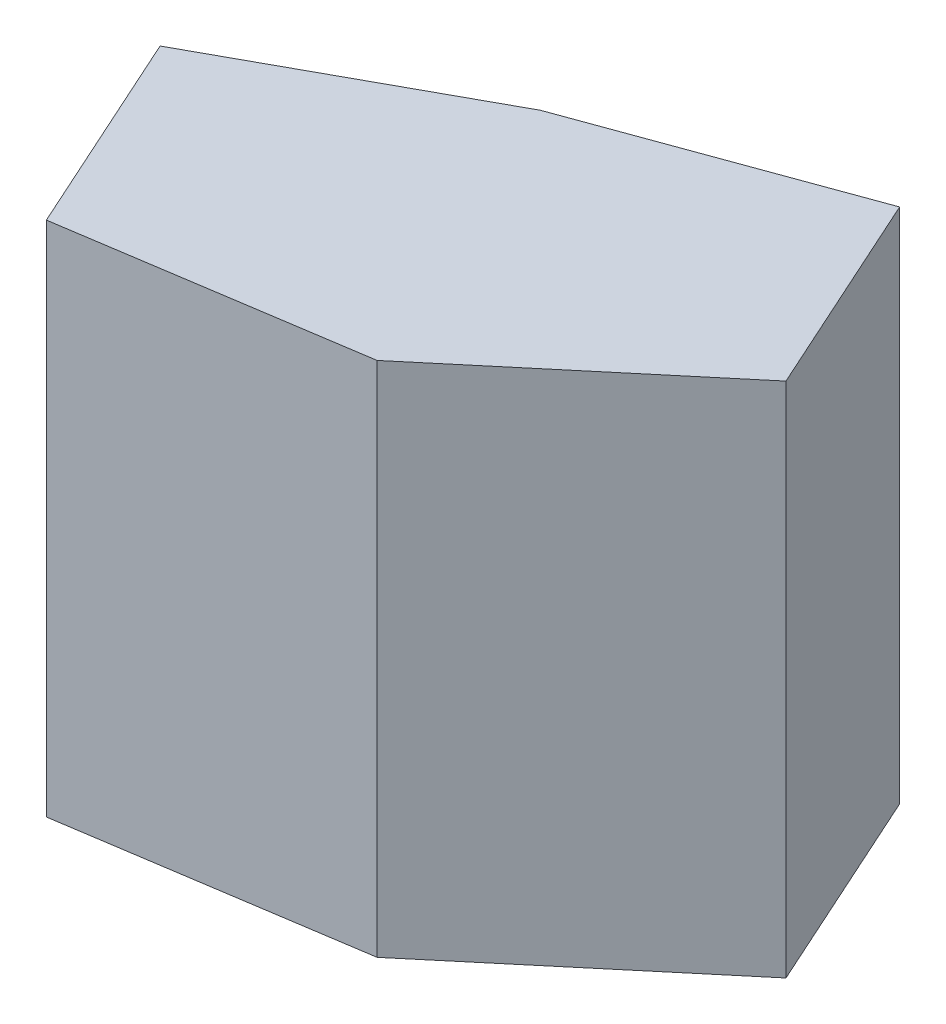
ISO-10303-21;
HEADER;
FILE_DESCRIPTION(('STEP AP214'),'2;1');
FILE_NAME('part.step','',(''),(''),'','','');
FILE_SCHEMA(('AUTOMOTIVE_DESIGN { 1 0 10303 214 1 1 1 1 }'));
ENDSEC;
DATA;
#1=APPLICATION_CONTEXT('core data for automotive mechanical design processes');
#2=APPLICATION_PROTOCOL_DEFINITION('international standard','automotive_design',2000,#1);
#3=PRODUCT_CONTEXT('',#1,'mechanical');
#4=PRODUCT('Part','Part','',(#3));
#5=PRODUCT_RELATED_PRODUCT_CATEGORY('part','',(#4));
#6=PRODUCT_DEFINITION_FORMATION('','',#4);
#7=PRODUCT_DEFINITION_CONTEXT('part definition',#1,'design');
#8=PRODUCT_DEFINITION('design','',#6,#7);
#9=PRODUCT_DEFINITION_SHAPE('','',#8);
#10=(LENGTH_UNIT() NAMED_UNIT(*) SI_UNIT(.MILLI.,.METRE.));
#11=(NAMED_UNIT(*) PLANE_ANGLE_UNIT() SI_UNIT($,.RADIAN.));
#12=(NAMED_UNIT(*) SI_UNIT($,.STERADIAN.) SOLID_ANGLE_UNIT());
#13=UNCERTAINTY_MEASURE_WITH_UNIT(LENGTH_MEASURE(1.E-05),#10,'distance_accuracy_value','');
#14=(GEOMETRIC_REPRESENTATION_CONTEXT(3) GLOBAL_UNCERTAINTY_ASSIGNED_CONTEXT((#13)) GLOBAL_UNIT_ASSIGNED_CONTEXT((#10,
#11,#12)) REPRESENTATION_CONTEXT('',''));
#15=CARTESIAN_POINT('',(0.,0.,0.));
#16=DIRECTION('',(0.,0.,1.));
#17=DIRECTION('',(1.,0.,0.));
#18=AXIS2_PLACEMENT_3D('',#15,#16,#17);
#19=CARTESIAN_POINT('',(-15.1608957547809,6.5,5.51811477955297));
#20=DIRECTION('',(0.342020143325662,0.,0.939692620785911));
#21=DIRECTION('',(0.939692620785911,0.,-0.342020143325662));
#22=AXIS2_PLACEMENT_3D('',#19,#20,#21);
#23=PLANE('',#22);
#24=DIRECTION('',(-0.939692620785911,0.,0.342020143325662));
#25=VECTOR('',#24,1.);
#26=CARTESIAN_POINT('',(-15.1608957547809,-6.5,5.51811477955297));
#27=LINE('',#26,#25);
#28=CARTESIAN_POINT('',(-15.1608957547809,-6.5,5.51811477955297));
#29=VERTEX_POINT('',#28);
#30=CARTESIAN_POINT('',(-21.7832392461402,-6.5,7.92845069149422));
#31=VERTEX_POINT('',#30);
#32=EDGE_CURVE('E134',#29,#31,#27,.T.);
#33=ORIENTED_EDGE('',*,*,#32,.T.);
#34=DIRECTION('',(0.,-1.,0.));
#35=VECTOR('',#34,1.);
#36=CARTESIAN_POINT('',(-21.7832392461402,6.5,7.92845069149422));
#37=LINE('',#36,#35);
#38=CARTESIAN_POINT('',(-21.7832392461402,6.5,7.92845069149421));
#39=VERTEX_POINT('',#38);
#40=EDGE_CURVE('E131',#39,#31,#37,.T.);
#41=ORIENTED_EDGE('',*,*,#40,.F.);
#42=DIRECTION('',(-0.939692620785911,0.,0.342020143325662));
#43=VECTOR('',#42,1.);
#44=CARTESIAN_POINT('',(-15.1608957547809,6.5,5.51811477955297));
#45=LINE('',#44,#43);
#46=CARTESIAN_POINT('',(-15.1608957547809,6.5,5.51811477955297));
#47=VERTEX_POINT('',#46);
#48=EDGE_CURVE('E79',#47,#39,#45,.T.);
#49=ORIENTED_EDGE('',*,*,#48,.F.);
#50=DIRECTION('',(0.,-1.,0.));
#51=VECTOR('',#50,1.);
#52=CARTESIAN_POINT('',(-15.1608957547809,6.5,5.51811477955297));
#53=LINE('',#52,#51);
#54=EDGE_CURVE('E47',#47,#29,#53,.T.);
#55=ORIENTED_EDGE('',*,*,#54,.T.);
#56=EDGE_LOOP('',(#33,#41,#49,#55));
#57=FACE_BOUND('',#56,.T.);
#58=ADVANCED_FACE('F39',(#57),#23,.F.);
#59=CARTESIAN_POINT('',(-18.3890627700506,6.5,15.4302557880451));
#60=DIRECTION('',(-0.642787609686535,0.,-0.766044443118981));
#61=DIRECTION('',(-0.766044443118981,0.,0.642787609686535));
#62=AXIS2_PLACEMENT_3D('',#59,#60,#61);
#63=PLANE('',#62);
#64=DIRECTION('',(0.766044443118981,0.,-0.642787609686535));
#65=VECTOR('',#64,1.);
#66=CARTESIAN_POINT('',(-18.3890627700506,-6.5,15.4302557880451));
#67=LINE('',#66,#65);
#68=CARTESIAN_POINT('',(-18.3890627700506,-6.5,15.4302557880451));
#69=VERTEX_POINT('',#68);
#70=CARTESIAN_POINT('',(-12.7983340868303,-6.5,10.7390774119428));
#71=VERTEX_POINT('',#70);
#72=EDGE_CURVE('E69',#69,#71,#67,.T.);
#73=ORIENTED_EDGE('',*,*,#72,.T.);
#74=DIRECTION('',(0.,-1.,0.));
#75=VECTOR('',#74,1.);
#76=CARTESIAN_POINT('',(-12.7983340868303,6.5,10.7390774119428));
#77=LINE('',#76,#75);
#78=CARTESIAN_POINT('',(-12.7983340868303,6.5,10.7390774119428));
#79=VERTEX_POINT('',#78);
#80=EDGE_CURVE('E11',#79,#71,#77,.T.);
#81=ORIENTED_EDGE('',*,*,#80,.F.);
#82=DIRECTION('',(0.766044443118981,0.,-0.642787609686535));
#83=VECTOR('',#82,1.);
#84=CARTESIAN_POINT('',(-18.3890627700506,6.5,15.4302557880451));
#85=LINE('',#84,#83);
#86=CARTESIAN_POINT('',(-18.3890627700506,6.5,15.4302557880451));
#87=VERTEX_POINT('',#86);
#88=EDGE_CURVE('E136',#87,#79,#85,.T.);
#89=ORIENTED_EDGE('',*,*,#88,.F.);
#90=DIRECTION('',(0.,-1.,0.));
#91=VECTOR('',#90,1.);
#92=CARTESIAN_POINT('',(-18.3890627700506,6.5,15.4302557880451));
#93=LINE('',#92,#91);
#94=EDGE_CURVE('E117',#87,#69,#93,.T.);
#95=ORIENTED_EDGE('',*,*,#94,.T.);
#96=EDGE_LOOP('',(#73,#81,#89,#95));
#97=FACE_BOUND('',#96,.T.);
#98=ADVANCED_FACE('F159',(#97),#63,.F.);
#99=CARTESIAN_POINT('',(-12.7983340868303,6.5,10.7390774119428));
#100=DIRECTION('',(-0.911062202068073,0.,0.412268921897919));
#101=DIRECTION('',(0.412268921897919,0.,0.911062202068074));
#102=AXIS2_PLACEMENT_3D('',#99,#100,#101);
#103=PLANE('',#102);
#104=DIRECTION('',(-0.412268921897919,0.,-0.911062202068073));
#105=VECTOR('',#104,1.);
#106=CARTESIAN_POINT('',(-12.7983340868303,-6.5,10.7390774119428));
#107=LINE('',#106,#105);
#108=EDGE_CURVE('E74',#71,#29,#107,.T.);
#109=ORIENTED_EDGE('',*,*,#108,.T.);
#110=ORIENTED_EDGE('',*,*,#54,.F.);
#111=DIRECTION('',(-0.412268921897919,0.,-0.911062202068073));
#112=VECTOR('',#111,1.);
#113=CARTESIAN_POINT('',(-12.7983340868303,6.5,10.7390774119428));
#114=LINE('',#113,#112);
#115=EDGE_CURVE('E55',#79,#47,#114,.T.);
#116=ORIENTED_EDGE('',*,*,#115,.F.);
#117=ORIENTED_EDGE('',*,*,#80,.T.);
#118=EDGE_LOOP('',(#109,#110,#116,#117));
#119=FACE_BOUND('',#118,.T.);
#120=ADVANCED_FACE('F164',(#119),#103,.F.);
#121=CARTESIAN_POINT('',(0.,6.5,0.));
#122=DIRECTION('',(0.,1.,0.));
#123=DIRECTION('',(0.,0.,1.));
#124=AXIS2_PLACEMENT_3D('',#121,#122,#123);
#125=PLANE('',#124);
#126=ORIENTED_EDGE('',*,*,#48,.T.);
#127=DIRECTION('',(0.877242075717445,0.,-0.480048269021927));
#128=VECTOR('',#127,1.);
#129=CARTESIAN_POINT('',(-27.9654718421727,6.5,11.3115192179203));
#130=LINE('',#129,#128);
#131=CARTESIAN_POINT('',(-27.9654718421727,6.5,11.3115192179203));
#132=VERTEX_POINT('',#131);
#133=EDGE_CURVE('E104',#132,#39,#130,.T.);
#134=ORIENTED_EDGE('',*,*,#133,.F.);
#135=DIRECTION('',(-0.412168184909907,0.,-0.911107780313654));
#136=VECTOR('',#135,1.);
#137=CARTESIAN_POINT('',(-25.603487460876,6.5,16.5327430424839));
#138=LINE('',#137,#136);
#139=CARTESIAN_POINT('',(-25.603487460876,6.5,16.5327430424839));
#140=VERTEX_POINT('',#139);
#141=EDGE_CURVE('E97',#140,#132,#138,.T.);
#142=ORIENTED_EDGE('',*,*,#141,.F.);
#143=DIRECTION('',(-0.988524082968715,0.,0.151063355552765));
#144=VECTOR('',#143,1.);
#145=CARTESIAN_POINT('',(-18.3890627700506,6.5,15.4302557880451));
#146=LINE('',#145,#144);
#147=EDGE_CURVE('E101',#87,#140,#146,.T.);
#148=ORIENTED_EDGE('',*,*,#147,.F.);
#149=ORIENTED_EDGE('',*,*,#88,.T.);
#150=ORIENTED_EDGE('',*,*,#115,.T.);
#151=EDGE_LOOP('',(#126,#134,#142,#148,#149,#150));
#152=FACE_BOUND('',#151,.T.);
#153=ADVANCED_FACE('F99',(#152),#125,.T.);
#154=CARTESIAN_POINT('',(0.,-6.5,0.));
#155=DIRECTION('',(0.,1.,0.));
#156=DIRECTION('',(0.,0.,1.));
#157=AXIS2_PLACEMENT_3D('',#154,#155,#156);
#158=PLANE('',#157);
#159=ORIENTED_EDGE('',*,*,#32,.F.);
#160=ORIENTED_EDGE('',*,*,#108,.F.);
#161=ORIENTED_EDGE('',*,*,#72,.F.);
#162=DIRECTION('',(-0.988524082968715,0.,0.151063355552765));
#163=VECTOR('',#162,1.);
#164=CARTESIAN_POINT('',(-18.3890627700506,-6.5,15.4302557880451));
#165=LINE('',#164,#163);
#166=CARTESIAN_POINT('',(-25.603487460876,-6.5,16.5327430424839));
#167=VERTEX_POINT('',#166);
#168=EDGE_CURVE('E126',#69,#167,#165,.T.);
#169=ORIENTED_EDGE('',*,*,#168,.T.);
#170=DIRECTION('',(-0.412168184909907,0.,-0.911107780313654));
#171=VECTOR('',#170,1.);
#172=CARTESIAN_POINT('',(-25.603487460876,-6.5,16.5327430424839));
#173=LINE('',#172,#171);
#174=CARTESIAN_POINT('',(-27.9654718421727,-6.5,11.3115192179203));
#175=VERTEX_POINT('',#174);
#176=EDGE_CURVE('E113',#167,#175,#173,.T.);
#177=ORIENTED_EDGE('',*,*,#176,.T.);
#178=DIRECTION('',(0.877242075717445,0.,-0.480048269021927));
#179=VECTOR('',#178,1.);
#180=CARTESIAN_POINT('',(-27.9654718421727,-6.5,11.3115192179203));
#181=LINE('',#180,#179);
#182=EDGE_CURVE('E123',#175,#31,#181,.T.);
#183=ORIENTED_EDGE('',*,*,#182,.T.);
#184=EDGE_LOOP('',(#159,#160,#161,#169,#177,#183));
#185=FACE_BOUND('',#184,.T.);
#186=ADVANCED_FACE('F144',(#185),#158,.F.);
#187=CARTESIAN_POINT('',(-27.9654718421727,6.5,11.3115192179203));
#188=DIRECTION('',(0.480048269021927,0.,0.877242075717445));
#189=DIRECTION('',(-0.877242075717445,0.,0.480048269021927));
#190=AXIS2_PLACEMENT_3D('',#187,#188,#189);
#191=PLANE('',#190);
#192=ORIENTED_EDGE('',*,*,#182,.F.);
#193=DIRECTION('',(0.,-1.,0.));
#194=VECTOR('',#193,1.);
#195=CARTESIAN_POINT('',(-27.9654718421727,6.5,11.3115192179203));
#196=LINE('',#195,#194);
#197=EDGE_CURVE('E108',#132,#175,#196,.T.);
#198=ORIENTED_EDGE('',*,*,#197,.F.);
#199=ORIENTED_EDGE('',*,*,#133,.T.);
#200=ORIENTED_EDGE('',*,*,#40,.T.);
#201=EDGE_LOOP('',(#192,#198,#199,#200));
#202=FACE_BOUND('',#201,.T.);
#203=ADVANCED_FACE('F147',(#202),#191,.F.);
#204=CARTESIAN_POINT('',(-18.3890627700506,6.5,15.4302557880451));
#205=DIRECTION('',(-0.151063355552765,0.,-0.988524082968715));
#206=DIRECTION('',(0.988524082968715,0.,-0.151063355552765));
#207=AXIS2_PLACEMENT_3D('',#204,#205,#206);
#208=PLANE('',#207);
#209=ORIENTED_EDGE('',*,*,#168,.F.);
#210=ORIENTED_EDGE('',*,*,#94,.F.);
#211=ORIENTED_EDGE('',*,*,#147,.T.);
#212=DIRECTION('',(0.,-1.,0.));
#213=VECTOR('',#212,1.);
#214=CARTESIAN_POINT('',(-25.603487460876,6.5,16.5327430424839));
#215=LINE('',#214,#213);
#216=EDGE_CURVE('E111',#140,#167,#215,.T.);
#217=ORIENTED_EDGE('',*,*,#216,.T.);
#218=EDGE_LOOP('',(#209,#210,#211,#217));
#219=FACE_BOUND('',#218,.T.);
#220=ADVANCED_FACE('F119',(#219),#208,.F.);
#221=CARTESIAN_POINT('',(-25.603487460876,6.5,16.5327430424839));
#222=DIRECTION('',(0.911107780313654,0.,-0.412168184909907));
#223=DIRECTION('',(0.412168184909907,0.,0.911107780313654));
#224=AXIS2_PLACEMENT_3D('',#221,#222,#223);
#225=PLANE('',#224);
#226=ORIENTED_EDGE('',*,*,#176,.F.);
#227=ORIENTED_EDGE('',*,*,#216,.F.);
#228=ORIENTED_EDGE('',*,*,#141,.T.);
#229=ORIENTED_EDGE('',*,*,#197,.T.);
#230=EDGE_LOOP('',(#226,#227,#228,#229));
#231=FACE_BOUND('',#230,.T.);
#232=ADVANCED_FACE('F112',(#231),#225,.F.);
#233=CLOSED_SHELL('',(#58,#98,#120,#153,#186,#203,#220,#232));
#234=MANIFOLD_SOLID_BREP('B2',#233);
#235=ADVANCED_BREP_SHAPE_REPRESENTATION('',(#18,#234),#14);
#236=SHAPE_DEFINITION_REPRESENTATION(#9,#235);
ENDSEC;
END-ISO-10303-21;
